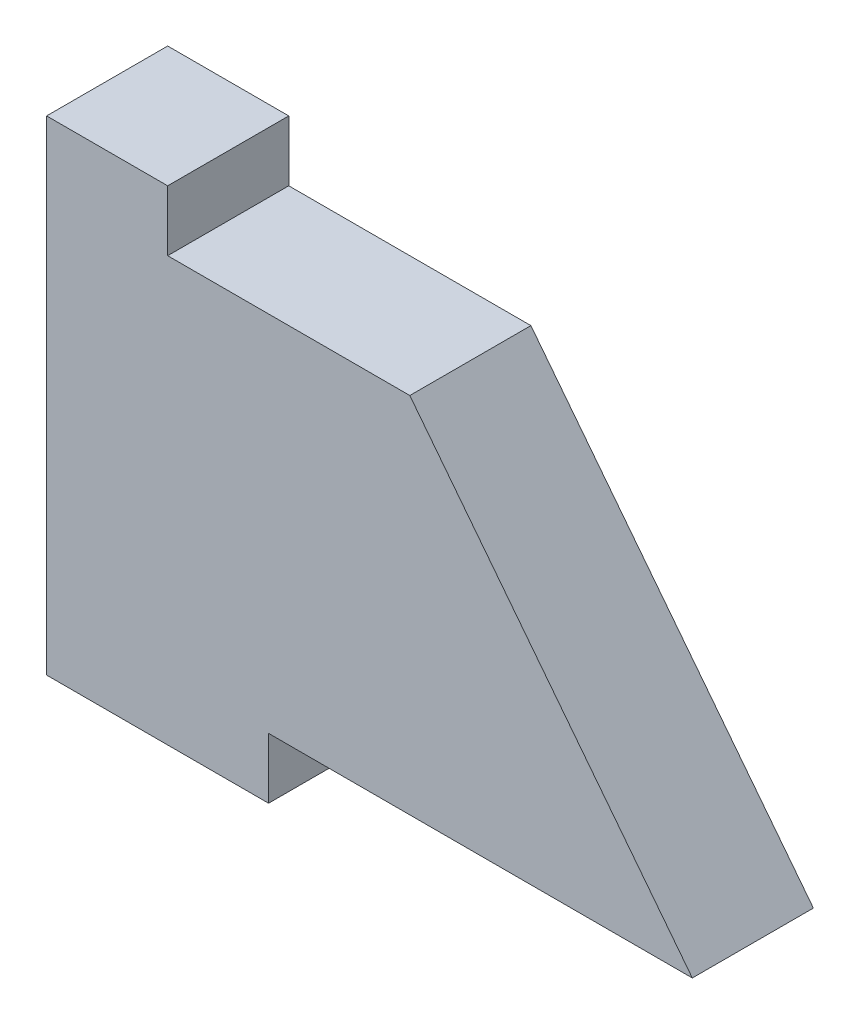
ISO-10303-21;
HEADER;
FILE_DESCRIPTION(('STEP AP214'),'2;1');
FILE_NAME('part.step','',(''),(''),'','','');
FILE_SCHEMA(('AUTOMOTIVE_DESIGN { 1 0 10303 214 1 1 1 1 }'));
ENDSEC;
DATA;
#1=APPLICATION_CONTEXT('core data for automotive mechanical design processes');
#2=APPLICATION_PROTOCOL_DEFINITION('international standard','automotive_design',2000,#1);
#3=PRODUCT_CONTEXT('',#1,'mechanical');
#4=PRODUCT('Part','Part','',(#3));
#5=PRODUCT_RELATED_PRODUCT_CATEGORY('part','',(#4));
#6=PRODUCT_DEFINITION_FORMATION('','',#4);
#7=PRODUCT_DEFINITION_CONTEXT('part definition',#1,'design');
#8=PRODUCT_DEFINITION('design','',#6,#7);
#9=PRODUCT_DEFINITION_SHAPE('','',#8);
#10=(LENGTH_UNIT() NAMED_UNIT(*) SI_UNIT(.MILLI.,.METRE.));
#11=(NAMED_UNIT(*) PLANE_ANGLE_UNIT() SI_UNIT($,.RADIAN.));
#12=(NAMED_UNIT(*) SI_UNIT($,.STERADIAN.) SOLID_ANGLE_UNIT());
#13=UNCERTAINTY_MEASURE_WITH_UNIT(LENGTH_MEASURE(1.E-05),#10,'distance_accuracy_value','');
#14=(GEOMETRIC_REPRESENTATION_CONTEXT(3) GLOBAL_UNCERTAINTY_ASSIGNED_CONTEXT((#13)) GLOBAL_UNIT_ASSIGNED_CONTEXT((#10,
#11,#12)) REPRESENTATION_CONTEXT('',''));
#15=CARTESIAN_POINT('',(0.,0.,0.));
#16=DIRECTION('',(0.,0.,1.));
#17=DIRECTION('',(1.,0.,0.));
#18=AXIS2_PLACEMENT_3D('',#15,#16,#17);
#19=CARTESIAN_POINT('',(0.,0.,3.));
#20=DIRECTION('',(0.,1.,0.));
#21=DIRECTION('',(0.,0.,1.));
#22=AXIS2_PLACEMENT_3D('',#19,#20,#21);
#23=PLANE('',#22);
#24=DIRECTION('',(0.,0.,1.));
#25=VECTOR('',#24,1.);
#26=CARTESIAN_POINT('',(5.5,0.,0.));
#27=LINE('',#26,#25);
#28=CARTESIAN_POINT('',(5.5,0.,0.));
#29=VERTEX_POINT('',#28);
#30=CARTESIAN_POINT('',(5.5,0.,3.));
#31=VERTEX_POINT('',#30);
#32=EDGE_CURVE('E48',#29,#31,#27,.T.);
#33=ORIENTED_EDGE('',*,*,#32,.F.);
#34=DIRECTION('',(1.,0.,0.));
#35=VECTOR('',#34,1.);
#36=CARTESIAN_POINT('',(0.,0.,0.));
#37=LINE('',#36,#35);
#38=CARTESIAN_POINT('',(16.,0.,0.));
#39=VERTEX_POINT('',#38);
#40=EDGE_CURVE('E109',#29,#39,#37,.T.);
#41=ORIENTED_EDGE('',*,*,#40,.T.);
#42=DIRECTION('',(0.,0.,-1.));
#43=VECTOR('',#42,1.);
#44=CARTESIAN_POINT('',(16.,0.,3.));
#45=LINE('',#44,#43);
#46=CARTESIAN_POINT('',(16.,0.,3.));
#47=VERTEX_POINT('',#46);
#48=EDGE_CURVE('E11',#47,#39,#45,.T.);
#49=ORIENTED_EDGE('',*,*,#48,.F.);
#50=DIRECTION('',(1.,0.,0.));
#51=VECTOR('',#50,1.);
#52=CARTESIAN_POINT('',(0.,0.,3.));
#53=LINE('',#52,#51);
#54=EDGE_CURVE('E154',#31,#47,#53,.T.);
#55=ORIENTED_EDGE('',*,*,#54,.F.);
#56=EDGE_LOOP('',(#33,#41,#49,#55));
#57=FACE_BOUND('',#56,.T.);
#58=ADVANCED_FACE('F33',(#57),#23,.F.);
#59=CARTESIAN_POINT('',(9.,9.,3.));
#60=DIRECTION('',(0.,-1.,0.));
#61=DIRECTION('',(1.,0.,0.));
#62=AXIS2_PLACEMENT_3D('',#59,#60,#61);
#63=PLANE('',#62);
#64=DIRECTION('',(0.,0.,-1.));
#65=VECTOR('',#64,1.);
#66=CARTESIAN_POINT('',(3.,9.,0.));
#67=LINE('',#66,#65);
#68=CARTESIAN_POINT('',(3.,9.,3.));
#69=VERTEX_POINT('',#68);
#70=CARTESIAN_POINT('',(3.,9.,0.));
#71=VERTEX_POINT('',#70);
#72=EDGE_CURVE('E56',#69,#71,#67,.T.);
#73=ORIENTED_EDGE('',*,*,#72,.F.);
#74=DIRECTION('',(-1.,0.,0.));
#75=VECTOR('',#74,1.);
#76=CARTESIAN_POINT('',(9.,9.,3.));
#77=LINE('',#76,#75);
#78=CARTESIAN_POINT('',(9.,9.,3.));
#79=VERTEX_POINT('',#78);
#80=EDGE_CURVE('E149',#79,#69,#77,.T.);
#81=ORIENTED_EDGE('',*,*,#80,.F.);
#82=DIRECTION('',(0.,0.,-1.));
#83=VECTOR('',#82,1.);
#84=CARTESIAN_POINT('',(9.,9.,3.));
#85=LINE('',#84,#83);
#86=CARTESIAN_POINT('',(9.,9.,0.));
#87=VERTEX_POINT('',#86);
#88=EDGE_CURVE('E41',#79,#87,#85,.T.);
#89=ORIENTED_EDGE('',*,*,#88,.T.);
#90=DIRECTION('',(-1.,0.,0.));
#91=VECTOR('',#90,1.);
#92=CARTESIAN_POINT('',(9.,9.,0.));
#93=LINE('',#92,#91);
#94=EDGE_CURVE('E110',#87,#71,#93,.T.);
#95=ORIENTED_EDGE('',*,*,#94,.T.);
#96=EDGE_LOOP('',(#73,#81,#89,#95));
#97=FACE_BOUND('',#96,.T.);
#98=ADVANCED_FACE('F35',(#97),#63,.F.);
#99=CARTESIAN_POINT('',(0.,9.,3.));
#100=DIRECTION('',(1.,0.,0.));
#101=DIRECTION('',(0.,0.,-1.));
#102=AXIS2_PLACEMENT_3D('',#99,#100,#101);
#103=PLANE('',#102);
#104=DIRECTION('',(0.,-1.,0.));
#105=VECTOR('',#104,1.);
#106=CARTESIAN_POINT('',(0.,9.,0.));
#107=LINE('',#106,#105);
#108=CARTESIAN_POINT('',(0.,10.5,0.));
#109=VERTEX_POINT('',#108);
#110=CARTESIAN_POINT('',(0.,-1.5,0.));
#111=VERTEX_POINT('',#110);
#112=EDGE_CURVE('E99',#109,#111,#107,.T.);
#113=ORIENTED_EDGE('',*,*,#112,.T.);
#114=DIRECTION('',(0.,0.,-1.));
#115=VECTOR('',#114,1.);
#116=CARTESIAN_POINT('',(0.,-1.5,0.));
#117=LINE('',#116,#115);
#118=CARTESIAN_POINT('',(0.,-1.5,3.));
#119=VERTEX_POINT('',#118);
#120=EDGE_CURVE('E103',#119,#111,#117,.T.);
#121=ORIENTED_EDGE('',*,*,#120,.F.);
#122=DIRECTION('',(0.,-1.,0.));
#123=VECTOR('',#122,1.);
#124=CARTESIAN_POINT('',(0.,9.,3.));
#125=LINE('',#124,#123);
#126=CARTESIAN_POINT('',(0.,10.5,3.));
#127=VERTEX_POINT('',#126);
#128=EDGE_CURVE('E151',#127,#119,#125,.T.);
#129=ORIENTED_EDGE('',*,*,#128,.F.);
#130=DIRECTION('',(0.,0.,1.));
#131=VECTOR('',#130,1.);
#132=CARTESIAN_POINT('',(0.,10.5,0.));
#133=LINE('',#132,#131);
#134=EDGE_CURVE('E105',#109,#127,#133,.T.);
#135=ORIENTED_EDGE('',*,*,#134,.F.);
#136=EDGE_LOOP('',(#113,#121,#129,#135));
#137=FACE_BOUND('',#136,.T.);
#138=ADVANCED_FACE('F101',(#137),#103,.F.);
#139=CARTESIAN_POINT('',(16.,0.,3.));
#140=DIRECTION('',(-0.789352217376326,-0.61394061351492,0.));
#141=DIRECTION('',(0.61394061351492,-0.789352217376326,0.));
#142=AXIS2_PLACEMENT_3D('',#139,#140,#141);
#143=PLANE('',#142);
#144=DIRECTION('',(-0.61394061351492,0.789352217376326,0.));
#145=VECTOR('',#144,1.);
#146=CARTESIAN_POINT('',(16.,0.,0.));
#147=LINE('',#146,#145);
#148=EDGE_CURVE('E152',#39,#87,#147,.T.);
#149=ORIENTED_EDGE('',*,*,#148,.T.);
#150=ORIENTED_EDGE('',*,*,#88,.F.);
#151=DIRECTION('',(-0.61394061351492,0.789352217376326,0.));
#152=VECTOR('',#151,1.);
#153=CARTESIAN_POINT('',(16.,0.,3.));
#154=LINE('',#153,#152);
#155=EDGE_CURVE('E156',#47,#79,#154,.T.);
#156=ORIENTED_EDGE('',*,*,#155,.F.);
#157=ORIENTED_EDGE('',*,*,#48,.T.);
#158=EDGE_LOOP('',(#149,#150,#156,#157));
#159=FACE_BOUND('',#158,.T.);
#160=ADVANCED_FACE('F174',(#159),#143,.F.);
#161=CARTESIAN_POINT('',(0.,0.,3.));
#162=DIRECTION('',(0.,0.,1.));
#163=DIRECTION('',(1.,0.,0.));
#164=AXIS2_PLACEMENT_3D('',#161,#162,#163);
#165=PLANE('',#164);
#166=ORIENTED_EDGE('',*,*,#80,.T.);
#167=DIRECTION('',(0.,-1.,0.));
#168=VECTOR('',#167,1.);
#169=CARTESIAN_POINT('',(3.,10.5,3.));
#170=LINE('',#169,#168);
#171=CARTESIAN_POINT('',(3.,10.5,3.));
#172=VERTEX_POINT('',#171);
#173=EDGE_CURVE('E146',#172,#69,#170,.T.);
#174=ORIENTED_EDGE('',*,*,#173,.F.);
#175=DIRECTION('',(1.,0.,0.));
#176=VECTOR('',#175,1.);
#177=CARTESIAN_POINT('',(0.,10.5,3.));
#178=LINE('',#177,#176);
#179=EDGE_CURVE('E136',#127,#172,#178,.T.);
#180=ORIENTED_EDGE('',*,*,#179,.F.);
#181=ORIENTED_EDGE('',*,*,#128,.T.);
#182=DIRECTION('',(-1.,0.,0.));
#183=VECTOR('',#182,1.);
#184=CARTESIAN_POINT('',(0.,-1.5,3.));
#185=LINE('',#184,#183);
#186=CARTESIAN_POINT('',(5.5,-1.5,3.));
#187=VERTEX_POINT('',#186);
#188=EDGE_CURVE('E125',#187,#119,#185,.T.);
#189=ORIENTED_EDGE('',*,*,#188,.F.);
#190=DIRECTION('',(0.,1.,0.));
#191=VECTOR('',#190,1.);
#192=CARTESIAN_POINT('',(5.5,-1.5,3.));
#193=LINE('',#192,#191);
#194=EDGE_CURVE('E130',#187,#31,#193,.T.);
#195=ORIENTED_EDGE('',*,*,#194,.T.);
#196=ORIENTED_EDGE('',*,*,#54,.T.);
#197=ORIENTED_EDGE('',*,*,#155,.T.);
#198=EDGE_LOOP('',(#166,#174,#180,#181,#189,#195,#196,#197));
#199=FACE_BOUND('',#198,.T.);
#200=ADVANCED_FACE('F172',(#199),#165,.T.);
#201=CARTESIAN_POINT('',(0.,0.,0.));
#202=DIRECTION('',(0.,0.,1.));
#203=DIRECTION('',(1.,0.,0.));
#204=AXIS2_PLACEMENT_3D('',#201,#202,#203);
#205=PLANE('',#204);
#206=ORIENTED_EDGE('',*,*,#94,.F.);
#207=ORIENTED_EDGE('',*,*,#148,.F.);
#208=ORIENTED_EDGE('',*,*,#40,.F.);
#209=DIRECTION('',(0.,1.,0.));
#210=VECTOR('',#209,1.);
#211=CARTESIAN_POINT('',(5.5,-1.5,0.));
#212=LINE('',#211,#210);
#213=CARTESIAN_POINT('',(5.5,-1.5,0.));
#214=VERTEX_POINT('',#213);
#215=EDGE_CURVE('E117',#214,#29,#212,.T.);
#216=ORIENTED_EDGE('',*,*,#215,.F.);
#217=DIRECTION('',(1.,0.,0.));
#218=VECTOR('',#217,1.);
#219=CARTESIAN_POINT('',(0.,-1.5,0.));
#220=LINE('',#219,#218);
#221=EDGE_CURVE('E113',#111,#214,#220,.T.);
#222=ORIENTED_EDGE('',*,*,#221,.F.);
#223=ORIENTED_EDGE('',*,*,#112,.F.);
#224=DIRECTION('',(-1.,0.,0.));
#225=VECTOR('',#224,1.);
#226=CARTESIAN_POINT('',(0.,10.5,0.));
#227=LINE('',#226,#225);
#228=CARTESIAN_POINT('',(3.,10.5,0.));
#229=VERTEX_POINT('',#228);
#230=EDGE_CURVE('E140',#229,#109,#227,.T.);
#231=ORIENTED_EDGE('',*,*,#230,.F.);
#232=DIRECTION('',(0.,-1.,0.));
#233=VECTOR('',#232,1.);
#234=CARTESIAN_POINT('',(3.,10.5,0.));
#235=LINE('',#234,#233);
#236=EDGE_CURVE('E142',#229,#71,#235,.T.);
#237=ORIENTED_EDGE('',*,*,#236,.T.);
#238=EDGE_LOOP('',(#206,#207,#208,#216,#222,#223,#231,#237));
#239=FACE_BOUND('',#238,.T.);
#240=ADVANCED_FACE('F115',(#239),#205,.F.);
#241=CARTESIAN_POINT('',(3.,10.5,0.));
#242=DIRECTION('',(-1.,0.,0.));
#243=DIRECTION('',(0.,-1.,0.));
#244=AXIS2_PLACEMENT_3D('',#241,#242,#243);
#245=PLANE('',#244);
#246=ORIENTED_EDGE('',*,*,#72,.T.);
#247=ORIENTED_EDGE('',*,*,#236,.F.);
#248=DIRECTION('',(0.,0.,-1.));
#249=VECTOR('',#248,1.);
#250=CARTESIAN_POINT('',(3.,10.5,0.));
#251=LINE('',#250,#249);
#252=EDGE_CURVE('E138',#172,#229,#251,.T.);
#253=ORIENTED_EDGE('',*,*,#252,.F.);
#254=ORIENTED_EDGE('',*,*,#173,.T.);
#255=EDGE_LOOP('',(#246,#247,#253,#254));
#256=FACE_BOUND('',#255,.T.);
#257=ADVANCED_FACE('F168',(#256),#245,.F.);
#258=CARTESIAN_POINT('',(0.,10.5,0.));
#259=DIRECTION('',(0.,1.,0.));
#260=DIRECTION('',(-1.,0.,0.));
#261=AXIS2_PLACEMENT_3D('',#258,#259,#260);
#262=PLANE('',#261);
#263=ORIENTED_EDGE('',*,*,#134,.T.);
#264=ORIENTED_EDGE('',*,*,#179,.T.);
#265=ORIENTED_EDGE('',*,*,#252,.T.);
#266=ORIENTED_EDGE('',*,*,#230,.T.);
#267=EDGE_LOOP('',(#263,#264,#265,#266));
#268=FACE_BOUND('',#267,.T.);
#269=ADVANCED_FACE('F179',(#268),#262,.T.);
#270=CARTESIAN_POINT('',(5.5,-1.5,0.));
#271=DIRECTION('',(-1.,0.,0.));
#272=DIRECTION('',(0.,0.,1.));
#273=AXIS2_PLACEMENT_3D('',#270,#271,#272);
#274=PLANE('',#273);
#275=ORIENTED_EDGE('',*,*,#32,.T.);
#276=ORIENTED_EDGE('',*,*,#194,.F.);
#277=DIRECTION('',(0.,0.,1.));
#278=VECTOR('',#277,1.);
#279=CARTESIAN_POINT('',(5.5,-1.5,0.));
#280=LINE('',#279,#278);
#281=EDGE_CURVE('E120',#214,#187,#280,.T.);
#282=ORIENTED_EDGE('',*,*,#281,.F.);
#283=ORIENTED_EDGE('',*,*,#215,.T.);
#284=EDGE_LOOP('',(#275,#276,#282,#283));
#285=FACE_BOUND('',#284,.T.);
#286=ADVANCED_FACE('F176',(#285),#274,.F.);
#287=CARTESIAN_POINT('',(0.,-1.5,0.));
#288=DIRECTION('',(0.,1.,0.));
#289=DIRECTION('',(0.,0.,1.));
#290=AXIS2_PLACEMENT_3D('',#287,#288,#289);
#291=PLANE('',#290);
#292=ORIENTED_EDGE('',*,*,#120,.T.);
#293=ORIENTED_EDGE('',*,*,#221,.T.);
#294=ORIENTED_EDGE('',*,*,#281,.T.);
#295=ORIENTED_EDGE('',*,*,#188,.T.);
#296=EDGE_LOOP('',(#292,#293,#294,#295));
#297=FACE_BOUND('',#296,.T.);
#298=ADVANCED_FACE('F123',(#297),#291,.F.);
#299=CLOSED_SHELL('',(#58,#98,#138,#160,#200,#240,#257,#269,#286,#298));
#300=MANIFOLD_SOLID_BREP('B2',#299);
#301=ADVANCED_BREP_SHAPE_REPRESENTATION('',(#18,#300),#14);
#302=SHAPE_DEFINITION_REPRESENTATION(#9,#301);
ENDSEC;
END-ISO-10303-21;
